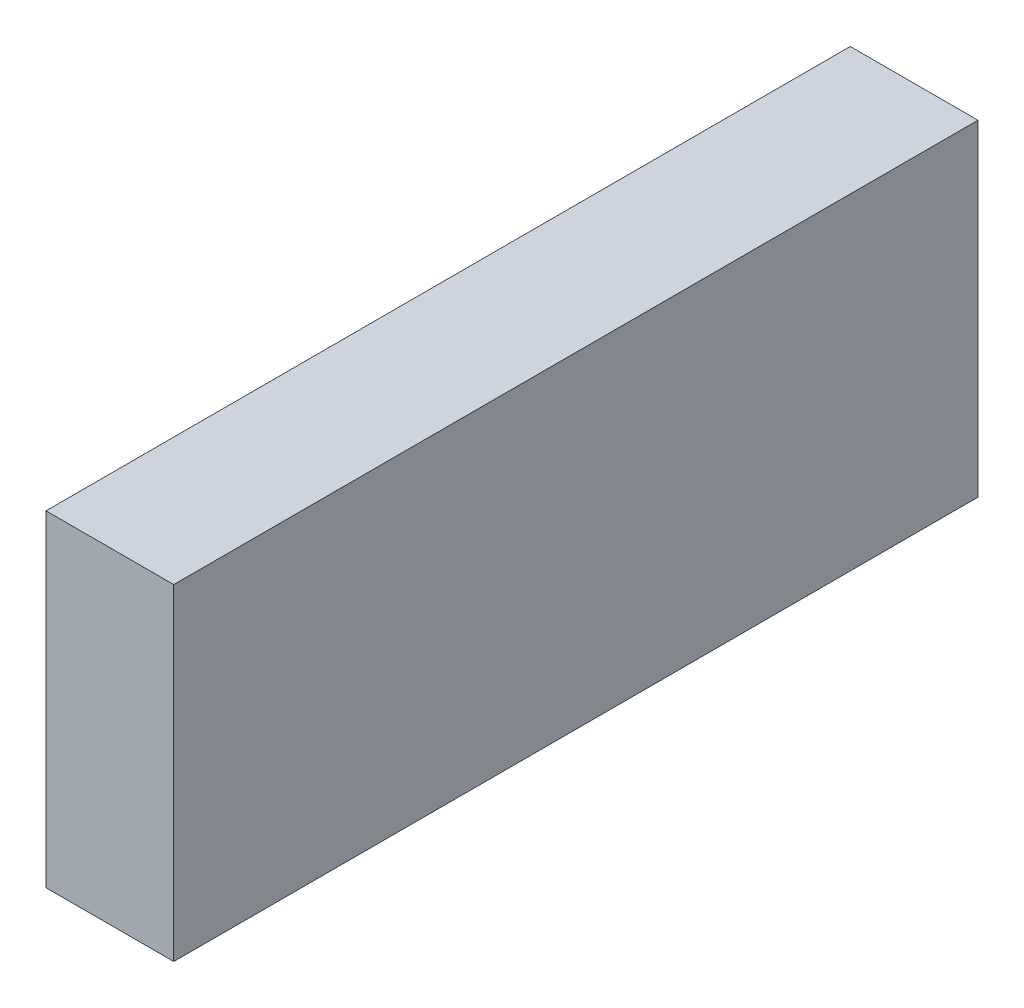
ISO-10303-21;
HEADER;
FILE_DESCRIPTION(('STEP AP214'),'2;1');
FILE_NAME('part.step','',(''),(''),'','','');
FILE_SCHEMA(('AUTOMOTIVE_DESIGN { 1 0 10303 214 1 1 1 1 }'));
ENDSEC;
DATA;
#1=APPLICATION_CONTEXT('core data for automotive mechanical design processes');
#2=APPLICATION_PROTOCOL_DEFINITION('international standard','automotive_design',2000,#1);
#3=PRODUCT_CONTEXT('',#1,'mechanical');
#4=PRODUCT('Part','Part','',(#3));
#5=PRODUCT_RELATED_PRODUCT_CATEGORY('part','',(#4));
#6=PRODUCT_DEFINITION_FORMATION('','',#4);
#7=PRODUCT_DEFINITION_CONTEXT('part definition',#1,'design');
#8=PRODUCT_DEFINITION('design','',#6,#7);
#9=PRODUCT_DEFINITION_SHAPE('','',#8);
#10=(LENGTH_UNIT() NAMED_UNIT(*) SI_UNIT(.MILLI.,.METRE.));
#11=(NAMED_UNIT(*) PLANE_ANGLE_UNIT() SI_UNIT($,.RADIAN.));
#12=(NAMED_UNIT(*) SI_UNIT($,.STERADIAN.) SOLID_ANGLE_UNIT());
#13=UNCERTAINTY_MEASURE_WITH_UNIT(LENGTH_MEASURE(1.E-05),#10,'distance_accuracy_value','');
#14=(GEOMETRIC_REPRESENTATION_CONTEXT(3) GLOBAL_UNCERTAINTY_ASSIGNED_CONTEXT((#13)) GLOBAL_UNIT_ASSIGNED_CONTEXT((#10,
#11,#12)) REPRESENTATION_CONTEXT('',''));
#15=CARTESIAN_POINT('',(0.,0.,0.));
#16=DIRECTION('',(0.,0.,1.));
#17=DIRECTION('',(1.,0.,0.));
#18=AXIS2_PLACEMENT_3D('',#15,#16,#17);
#19=CARTESIAN_POINT('',(27.,34.5,-85.));
#20=DIRECTION('',(0.,0.,1.));
#21=DIRECTION('',(0.,-1.,0.));
#22=AXIS2_PLACEMENT_3D('',#19,#20,#21);
#23=PLANE('',#22);
#24=DIRECTION('',(0.,1.,0.));
#25=VECTOR('',#24,1.);
#26=CARTESIAN_POINT('',(0.,34.5,-85.));
#27=LINE('',#26,#25);
#28=CARTESIAN_POINT('',(0.,-34.5,-85.));
#29=VERTEX_POINT('',#28);
#30=CARTESIAN_POINT('',(0.,34.5,-85.));
#31=VERTEX_POINT('',#30);
#32=EDGE_CURVE('E113',#29,#31,#27,.T.);
#33=ORIENTED_EDGE('',*,*,#32,.T.);
#34=DIRECTION('',(-1.,0.,0.));
#35=VECTOR('',#34,1.);
#36=CARTESIAN_POINT('',(27.,34.5,-85.));
#37=LINE('',#36,#35);
#38=CARTESIAN_POINT('',(27.,34.5,-85.));
#39=VERTEX_POINT('',#38);
#40=EDGE_CURVE('E11',#39,#31,#37,.T.);
#41=ORIENTED_EDGE('',*,*,#40,.F.);
#42=DIRECTION('',(0.,1.,0.));
#43=VECTOR('',#42,1.);
#44=CARTESIAN_POINT('',(27.,34.5,-85.));
#45=LINE('',#44,#43);
#46=CARTESIAN_POINT('',(27.,-34.5,-85.));
#47=VERTEX_POINT('',#46);
#48=EDGE_CURVE('E97',#47,#39,#45,.T.);
#49=ORIENTED_EDGE('',*,*,#48,.F.);
#50=DIRECTION('',(-1.,0.,0.));
#51=VECTOR('',#50,1.);
#52=CARTESIAN_POINT('',(27.,-34.5,-85.));
#53=LINE('',#52,#51);
#54=EDGE_CURVE('E109',#47,#29,#53,.T.);
#55=ORIENTED_EDGE('',*,*,#54,.T.);
#56=EDGE_LOOP('',(#33,#41,#49,#55));
#57=FACE_BOUND('',#56,.T.);
#58=ADVANCED_FACE('F45',(#57),#23,.F.);
#59=CARTESIAN_POINT('',(27.,34.5,85.));
#60=DIRECTION('',(0.,-1.,0.));
#61=DIRECTION('',(0.,0.,-1.));
#62=AXIS2_PLACEMENT_3D('',#59,#60,#61);
#63=PLANE('',#62);
#64=DIRECTION('',(0.,0.,1.));
#65=VECTOR('',#64,1.);
#66=CARTESIAN_POINT('',(0.,34.5,85.));
#67=LINE('',#66,#65);
#68=CARTESIAN_POINT('',(0.,34.5,85.));
#69=VERTEX_POINT('',#68);
#70=EDGE_CURVE('E102',#31,#69,#67,.T.);
#71=ORIENTED_EDGE('',*,*,#70,.T.);
#72=DIRECTION('',(-1.,0.,0.));
#73=VECTOR('',#72,1.);
#74=CARTESIAN_POINT('',(27.,34.5,85.));
#75=LINE('',#74,#73);
#76=CARTESIAN_POINT('',(27.,34.5,85.));
#77=VERTEX_POINT('',#76);
#78=EDGE_CURVE('E54',#77,#69,#75,.T.);
#79=ORIENTED_EDGE('',*,*,#78,.F.);
#80=DIRECTION('',(0.,0.,1.));
#81=VECTOR('',#80,1.);
#82=CARTESIAN_POINT('',(27.,34.5,85.));
#83=LINE('',#82,#81);
#84=EDGE_CURVE('E92',#39,#77,#83,.T.);
#85=ORIENTED_EDGE('',*,*,#84,.F.);
#86=ORIENTED_EDGE('',*,*,#40,.T.);
#87=EDGE_LOOP('',(#71,#79,#85,#86));
#88=FACE_BOUND('',#87,.T.);
#89=ADVANCED_FACE('F101',(#88),#63,.F.);
#90=CARTESIAN_POINT('',(27.,34.5,85.));
#91=DIRECTION('',(0.,0.,-1.));
#92=DIRECTION('',(0.,1.,0.));
#93=AXIS2_PLACEMENT_3D('',#90,#91,#92);
#94=PLANE('',#93);
#95=DIRECTION('',(0.,-1.,0.));
#96=VECTOR('',#95,1.);
#97=CARTESIAN_POINT('',(0.,34.5,85.));
#98=LINE('',#97,#96);
#99=CARTESIAN_POINT('',(0.,-34.5,85.));
#100=VERTEX_POINT('',#99);
#101=EDGE_CURVE('E79',#69,#100,#98,.T.);
#102=ORIENTED_EDGE('',*,*,#101,.T.);
#103=DIRECTION('',(-1.,0.,0.));
#104=VECTOR('',#103,1.);
#105=CARTESIAN_POINT('',(27.,-34.5,85.));
#106=LINE('',#105,#104);
#107=CARTESIAN_POINT('',(27.,-34.5,85.));
#108=VERTEX_POINT('',#107);
#109=EDGE_CURVE('E104',#108,#100,#106,.T.);
#110=ORIENTED_EDGE('',*,*,#109,.F.);
#111=DIRECTION('',(0.,-1.,0.));
#112=VECTOR('',#111,1.);
#113=CARTESIAN_POINT('',(27.,34.5,85.));
#114=LINE('',#113,#112);
#115=EDGE_CURVE('E95',#77,#108,#114,.T.);
#116=ORIENTED_EDGE('',*,*,#115,.F.);
#117=ORIENTED_EDGE('',*,*,#78,.T.);
#118=EDGE_LOOP('',(#102,#110,#116,#117));
#119=FACE_BOUND('',#118,.T.);
#120=ADVANCED_FACE('F105',(#119),#94,.F.);
#121=CARTESIAN_POINT('',(27.,-34.5,85.));
#122=DIRECTION('',(0.,1.,0.));
#123=DIRECTION('',(0.,0.,1.));
#124=AXIS2_PLACEMENT_3D('',#121,#122,#123);
#125=PLANE('',#124);
#126=DIRECTION('',(0.,0.,-1.));
#127=VECTOR('',#126,1.);
#128=CARTESIAN_POINT('',(0.,-34.5,85.));
#129=LINE('',#128,#127);
#130=EDGE_CURVE('E85',#100,#29,#129,.T.);
#131=ORIENTED_EDGE('',*,*,#130,.T.);
#132=ORIENTED_EDGE('',*,*,#54,.F.);
#133=DIRECTION('',(0.,0.,-1.));
#134=VECTOR('',#133,1.);
#135=CARTESIAN_POINT('',(27.,-34.5,85.));
#136=LINE('',#135,#134);
#137=EDGE_CURVE('E62',#108,#47,#136,.T.);
#138=ORIENTED_EDGE('',*,*,#137,.F.);
#139=ORIENTED_EDGE('',*,*,#109,.T.);
#140=EDGE_LOOP('',(#131,#132,#138,#139));
#141=FACE_BOUND('',#140,.T.);
#142=ADVANCED_FACE('F126',(#141),#125,.F.);
#143=CARTESIAN_POINT('',(27.,0.,0.));
#144=DIRECTION('',(1.,0.,0.));
#145=DIRECTION('',(0.,0.,-1.));
#146=AXIS2_PLACEMENT_3D('',#143,#144,#145);
#147=PLANE('',#146);
#148=ORIENTED_EDGE('',*,*,#48,.T.);
#149=ORIENTED_EDGE('',*,*,#84,.T.);
#150=ORIENTED_EDGE('',*,*,#115,.T.);
#151=ORIENTED_EDGE('',*,*,#137,.T.);
#152=EDGE_LOOP('',(#148,#149,#150,#151));
#153=FACE_BOUND('',#152,.T.);
#154=ADVANCED_FACE('F93',(#153),#147,.T.);
#155=CARTESIAN_POINT('',(0.,0.,0.));
#156=DIRECTION('',(1.,0.,0.));
#157=DIRECTION('',(0.,0.,-1.));
#158=AXIS2_PLACEMENT_3D('',#155,#156,#157);
#159=PLANE('',#158);
#160=ORIENTED_EDGE('',*,*,#32,.F.);
#161=ORIENTED_EDGE('',*,*,#130,.F.);
#162=ORIENTED_EDGE('',*,*,#101,.F.);
#163=ORIENTED_EDGE('',*,*,#70,.F.);
#164=EDGE_LOOP('',(#160,#161,#162,#163));
#165=FACE_BOUND('',#164,.T.);
#166=ADVANCED_FACE('F129',(#165),#159,.F.);
#167=CLOSED_SHELL('',(#58,#89,#120,#142,#154,#166));
#168=MANIFOLD_SOLID_BREP('B2',#167);
#169=ADVANCED_BREP_SHAPE_REPRESENTATION('',(#18,#168),#14);
#170=SHAPE_DEFINITION_REPRESENTATION(#9,#169);
ENDSEC;
END-ISO-10303-21;
